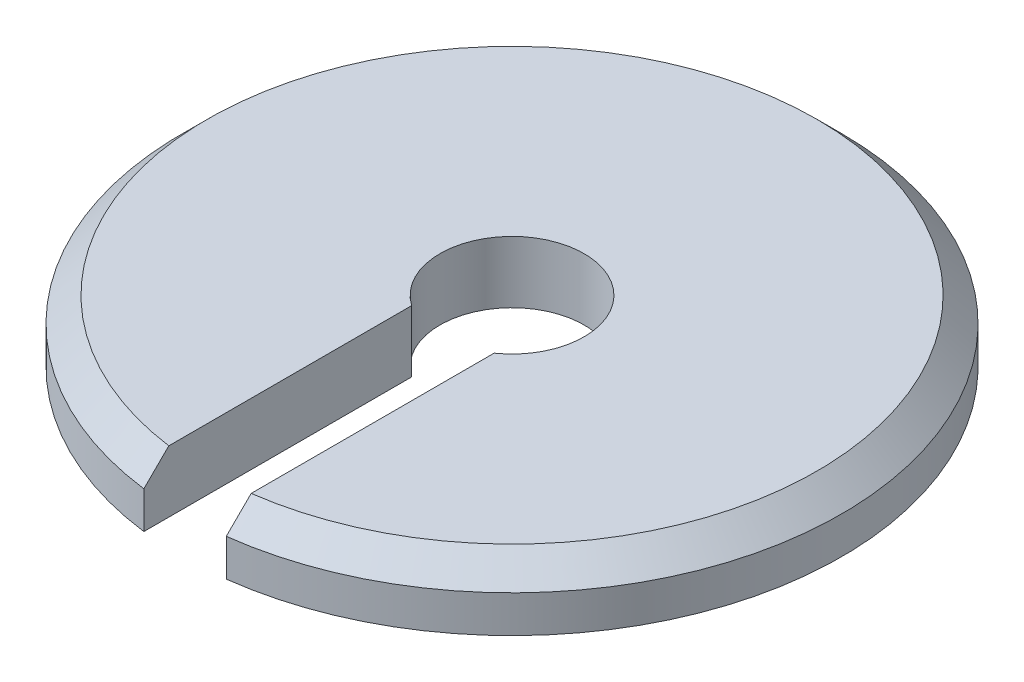
ISO-10303-21;
HEADER;
FILE_DESCRIPTION(('STEP AP214'),'2;1');
FILE_NAME('part.step','',(''),(''),'','','');
FILE_SCHEMA(('AUTOMOTIVE_DESIGN { 1 0 10303 214 1 1 1 1 }'));
ENDSEC;
DATA;
#1=APPLICATION_CONTEXT('core data for automotive mechanical design processes');
#2=APPLICATION_PROTOCOL_DEFINITION('international standard','automotive_design',2000,#1);
#3=PRODUCT_CONTEXT('',#1,'mechanical');
#4=PRODUCT('Part','Part','',(#3));
#5=PRODUCT_RELATED_PRODUCT_CATEGORY('part','',(#4));
#6=PRODUCT_DEFINITION_FORMATION('','',#4);
#7=PRODUCT_DEFINITION_CONTEXT('part definition',#1,'design');
#8=PRODUCT_DEFINITION('design','',#6,#7);
#9=PRODUCT_DEFINITION_SHAPE('','',#8);
#10=(LENGTH_UNIT() NAMED_UNIT(*) SI_UNIT(.MILLI.,.METRE.));
#11=(NAMED_UNIT(*) PLANE_ANGLE_UNIT() SI_UNIT($,.RADIAN.));
#12=(NAMED_UNIT(*) SI_UNIT($,.STERADIAN.) SOLID_ANGLE_UNIT());
#13=UNCERTAINTY_MEASURE_WITH_UNIT(LENGTH_MEASURE(1.E-05),#10,'distance_accuracy_value','');
#14=(GEOMETRIC_REPRESENTATION_CONTEXT(3) GLOBAL_UNCERTAINTY_ASSIGNED_CONTEXT((#13)) GLOBAL_UNIT_ASSIGNED_CONTEXT((#10,
#11,#12)) REPRESENTATION_CONTEXT('',''));
#15=CARTESIAN_POINT('',(0.,0.,0.));
#16=DIRECTION('',(0.,0.,1.));
#17=DIRECTION('',(1.,0.,0.));
#18=AXIS2_PLACEMENT_3D('',#15,#16,#17);
#19=CARTESIAN_POINT('',(0.,1.905,0.));
#20=DIRECTION('',(0.,-1.,0.));
#21=DIRECTION('',(0.,0.,-1.));
#22=AXIS2_PLACEMENT_3D('',#19,#20,#21);
#23=CYLINDRICAL_SURFACE('',#22,2.2225);
#24=CARTESIAN_POINT('',(0.,0.,0.));
#25=DIRECTION('',(0.,1.,0.));
#26=DIRECTION('',(0.,0.,1.));
#27=AXIS2_PLACEMENT_3D('',#24,#25,#26);
#28=CIRCLE('',#27,2.2225);
#29=CARTESIAN_POINT('',(1.27,0.,1.82389864027582));
#30=VERTEX_POINT('',#29);
#31=CARTESIAN_POINT('',(-1.27,0.,1.82389864027582));
#32=VERTEX_POINT('',#31);
#33=EDGE_CURVE('E113',#30,#32,#28,.T.);
#34=ORIENTED_EDGE('',*,*,#33,.F.);
#35=DIRECTION('',(0.,-1.,0.));
#36=VECTOR('',#35,1.);
#37=CARTESIAN_POINT('',(1.27,1.905,1.82389864027582));
#38=LINE('',#37,#36);
#39=CARTESIAN_POINT('',(1.27,1.905,1.82389864027582));
#40=VERTEX_POINT('',#39);
#41=EDGE_CURVE('E99',#40,#30,#38,.T.);
#42=ORIENTED_EDGE('',*,*,#41,.F.);
#43=CARTESIAN_POINT('',(0.,1.905,0.));
#44=DIRECTION('',(0.,1.,0.));
#45=DIRECTION('',(0.,0.,1.));
#46=AXIS2_PLACEMENT_3D('',#43,#44,#45);
#47=CIRCLE('',#46,2.2225);
#48=CARTESIAN_POINT('',(-1.27,1.905,1.82389864027582));
#49=VERTEX_POINT('',#48);
#50=EDGE_CURVE('E108',#40,#49,#47,.T.);
#51=ORIENTED_EDGE('',*,*,#50,.T.);
#52=DIRECTION('',(0.,-1.,0.));
#53=VECTOR('',#52,1.);
#54=CARTESIAN_POINT('',(-1.27,1.905,1.82389864027582));
#55=LINE('',#54,#53);
#56=EDGE_CURVE('E131',#49,#32,#55,.T.);
#57=ORIENTED_EDGE('',*,*,#56,.T.);
#58=EDGE_LOOP('',(#34,#42,#51,#57));
#59=FACE_BOUND('',#58,.T.);
#60=ADVANCED_FACE('F43',(#59),#23,.F.);
#61=CARTESIAN_POINT('',(1.27,1.905,0.));
#62=DIRECTION('',(-1.,0.,0.));
#63=DIRECTION('',(0.,0.,1.));
#64=AXIS2_PLACEMENT_3D('',#61,#62,#63);
#65=PLANE('',#64);
#66=DIRECTION('',(0.,-1.,0.));
#67=VECTOR('',#66,1.);
#68=CARTESIAN_POINT('',(1.27,1.905,10.0803124951561));
#69=LINE('',#68,#67);
#70=CARTESIAN_POINT('',(1.27,1.14300000000002,10.0803124951561));
#71=VERTEX_POINT('',#70);
#72=CARTESIAN_POINT('',(1.27,0.,10.0803124951561));
#73=VERTEX_POINT('',#72);
#74=EDGE_CURVE('E117',#71,#73,#69,.T.);
#75=ORIENTED_EDGE('',*,*,#74,.F.);
#76=CARTESIAN_POINT('',(1.27,1.14300000000002,10.0803124951561));
#77=CARTESIAN_POINT('',(1.27,1.27004287213701,9.95226855675518));
#78=CARTESIAN_POINT('',(1.27,1.39706430813624,9.82420336404081));
#79=CARTESIAN_POINT('',(1.27,1.65106430813632,9.56803046970563));
#80=CARTESIAN_POINT('',(1.27,1.77804287213709,9.43992276808473));
#81=CARTESIAN_POINT('',(1.27,1.905,9.31179381215028));
#82=B_SPLINE_CURVE_WITH_KNOTS('',3,(#76,#77,#78,#79,#80,#81),.UNSPECIFIED.,.F.,.F.,(4,2,4),(0.,
0.54112498472576,1.08224997063252),.UNSPECIFIED.);
#83=CARTESIAN_POINT('',(1.27,1.905,9.31179381215028));
#84=VERTEX_POINT('',#83);
#85=EDGE_CURVE('E11',#71,#84,#82,.T.);
#86=ORIENTED_EDGE('',*,*,#85,.T.);
#87=DIRECTION('',(0.,0.,-1.));
#88=VECTOR('',#87,1.);
#89=CARTESIAN_POINT('',(1.27,1.905,0.));
#90=LINE('',#89,#88);
#91=EDGE_CURVE('E95',#84,#40,#90,.T.);
#92=ORIENTED_EDGE('',*,*,#91,.T.);
#93=ORIENTED_EDGE('',*,*,#41,.T.);
#94=DIRECTION('',(0.,0.,-1.));
#95=VECTOR('',#94,1.);
#96=CARTESIAN_POINT('',(1.27,0.,0.));
#97=LINE('',#96,#95);
#98=EDGE_CURVE('E134',#73,#30,#97,.T.);
#99=ORIENTED_EDGE('',*,*,#98,.F.);
#100=EDGE_LOOP('',(#75,#86,#92,#93,#99));
#101=FACE_BOUND('',#100,.T.);
#102=ADVANCED_FACE('F97',(#101),#65,.T.);
#103=CARTESIAN_POINT('',(0.,1.905,0.));
#104=DIRECTION('',(0.,-1.,0.));
#105=DIRECTION('',(0.,0.,-1.));
#106=AXIS2_PLACEMENT_3D('',#103,#104,#105);
#107=CYLINDRICAL_SURFACE('',#106,10.16);
#108=DIRECTION('',(0.,-1.,0.));
#109=VECTOR('',#108,1.);
#110=CARTESIAN_POINT('',(-1.27,1.905,10.0803124951561));
#111=LINE('',#110,#109);
#112=CARTESIAN_POINT('',(-1.27,1.14300000000002,10.0803124951561));
#113=VERTEX_POINT('',#112);
#114=CARTESIAN_POINT('',(-1.27,0.,10.0803124951561));
#115=VERTEX_POINT('',#114);
#116=EDGE_CURVE('E142',#113,#115,#111,.T.);
#117=ORIENTED_EDGE('',*,*,#116,.F.);
#118=CARTESIAN_POINT('',(0.,1.14300000000002,0.));
#119=DIRECTION('',(0.,1.,0.));
#120=DIRECTION('',(0.,0.,1.));
#121=AXIS2_PLACEMENT_3D('',#118,#119,#120);
#122=CIRCLE('',#121,10.16);
#123=EDGE_CURVE('E59',#113,#71,#122,.F.);
#124=ORIENTED_EDGE('',*,*,#123,.T.);
#125=ORIENTED_EDGE('',*,*,#74,.T.);
#126=CARTESIAN_POINT('',(0.,0.,0.));
#127=DIRECTION('',(0.,1.,0.));
#128=DIRECTION('',(0.,0.,1.));
#129=AXIS2_PLACEMENT_3D('',#126,#127,#128);
#130=CIRCLE('',#129,10.16);
#131=EDGE_CURVE('E126',#73,#115,#130,.T.);
#132=ORIENTED_EDGE('',*,*,#131,.T.);
#133=EDGE_LOOP('',(#117,#124,#125,#132));
#134=FACE_BOUND('',#133,.T.);
#135=ADVANCED_FACE('F160',(#134),#107,.T.);
#136=CARTESIAN_POINT('',(-1.27,1.905,0.));
#137=DIRECTION('',(-1.,0.,0.));
#138=DIRECTION('',(0.,0.,1.));
#139=AXIS2_PLACEMENT_3D('',#136,#137,#138);
#140=PLANE('',#139);
#141=DIRECTION('',(0.,0.,-1.));
#142=VECTOR('',#141,1.);
#143=CARTESIAN_POINT('',(-1.27,1.905,0.));
#144=LINE('',#143,#142);
#145=CARTESIAN_POINT('',(-1.27,1.905,9.31179381215029));
#146=VERTEX_POINT('',#145);
#147=EDGE_CURVE('E107',#146,#49,#144,.T.);
#148=ORIENTED_EDGE('',*,*,#147,.F.);
#149=CARTESIAN_POINT('',(-1.27,1.905,9.31179381215029));
#150=CARTESIAN_POINT('',(-1.27,1.77804287213709,9.43992276808473));
#151=CARTESIAN_POINT('',(-1.27,1.65106430813632,9.56803046970563));
#152=CARTESIAN_POINT('',(-1.27,1.39706430813623,9.82420336404081));
#153=CARTESIAN_POINT('',(-1.27,1.27004287213701,9.95226855675518));
#154=CARTESIAN_POINT('',(-1.27,1.14300000000002,10.0803124951561));
#155=B_SPLINE_CURVE_WITH_KNOTS('',3,(#149,#150,#151,#152,#153,#154),.UNSPECIFIED.,.F.,.F.,(4,2,
4),(0.,0.54112498590676,1.08224997063252),.UNSPECIFIED.);
#156=EDGE_CURVE('E73',#146,#113,#155,.T.);
#157=ORIENTED_EDGE('',*,*,#156,.T.);
#158=ORIENTED_EDGE('',*,*,#116,.T.);
#159=DIRECTION('',(0.,0.,-1.));
#160=VECTOR('',#159,1.);
#161=CARTESIAN_POINT('',(-1.27,0.,0.));
#162=LINE('',#161,#160);
#163=EDGE_CURVE('E122',#115,#32,#162,.T.);
#164=ORIENTED_EDGE('',*,*,#163,.T.);
#165=ORIENTED_EDGE('',*,*,#56,.F.);
#166=EDGE_LOOP('',(#148,#157,#158,#164,#165));
#167=FACE_BOUND('',#166,.T.);
#168=ADVANCED_FACE('F155',(#167),#140,.F.);
#169=CARTESIAN_POINT('',(0.,1.905,0.));
#170=DIRECTION('',(0.,1.,0.));
#171=DIRECTION('',(0.,0.,1.));
#172=AXIS2_PLACEMENT_3D('',#169,#170,#171);
#173=PLANE('',#172);
#174=ORIENTED_EDGE('',*,*,#91,.F.);
#175=CARTESIAN_POINT('',(0.,1.905,0.));
#176=DIRECTION('',(0.,1.,0.));
#177=DIRECTION('',(0.,0.,1.));
#178=AXIS2_PLACEMENT_3D('',#175,#176,#177);
#179=CIRCLE('',#178,9.39800000000002);
#180=EDGE_CURVE('E116',#84,#146,#179,.T.);
#181=ORIENTED_EDGE('',*,*,#180,.T.);
#182=ORIENTED_EDGE('',*,*,#147,.T.);
#183=ORIENTED_EDGE('',*,*,#50,.F.);
#184=EDGE_LOOP('',(#174,#181,#182,#183));
#185=FACE_BOUND('',#184,.T.);
#186=ADVANCED_FACE('F119',(#185),#173,.T.);
#187=CARTESIAN_POINT('',(0.,0.,0.));
#188=DIRECTION('',(0.,1.,0.));
#189=DIRECTION('',(0.,0.,1.));
#190=AXIS2_PLACEMENT_3D('',#187,#188,#189);
#191=PLANE('',#190);
#192=ORIENTED_EDGE('',*,*,#33,.T.);
#193=ORIENTED_EDGE('',*,*,#163,.F.);
#194=ORIENTED_EDGE('',*,*,#131,.F.);
#195=ORIENTED_EDGE('',*,*,#98,.T.);
#196=EDGE_LOOP('',(#192,#193,#194,#195));
#197=FACE_BOUND('',#196,.T.);
#198=ADVANCED_FACE('F161',(#197),#191,.F.);
#199=CARTESIAN_POINT('',(0.,1.905,0.));
#200=DIRECTION('',(0.,-1.,0.));
#201=DIRECTION('',(0.,0.,-1.));
#202=AXIS2_PLACEMENT_3D('',#199,#200,#201);
#203=CONICAL_SURFACE('',#202,9.39800000000002,0.785398163397447);
#204=ORIENTED_EDGE('',*,*,#85,.F.);
#205=ORIENTED_EDGE('',*,*,#123,.F.);
#206=ORIENTED_EDGE('',*,*,#156,.F.);
#207=ORIENTED_EDGE('',*,*,#180,.F.);
#208=EDGE_LOOP('',(#204,#205,#206,#207));
#209=FACE_BOUND('',#208,.T.);
#210=ADVANCED_FACE('F46',(#209),#203,.T.);
#211=CLOSED_SHELL('',(#60,#102,#135,#168,#186,#198,#210));
#212=MANIFOLD_SOLID_BREP('B2',#211);
#213=ADVANCED_BREP_SHAPE_REPRESENTATION('',(#18,#212),#14);
#214=SHAPE_DEFINITION_REPRESENTATION(#9,#213);
ENDSEC;
END-ISO-10303-21;
